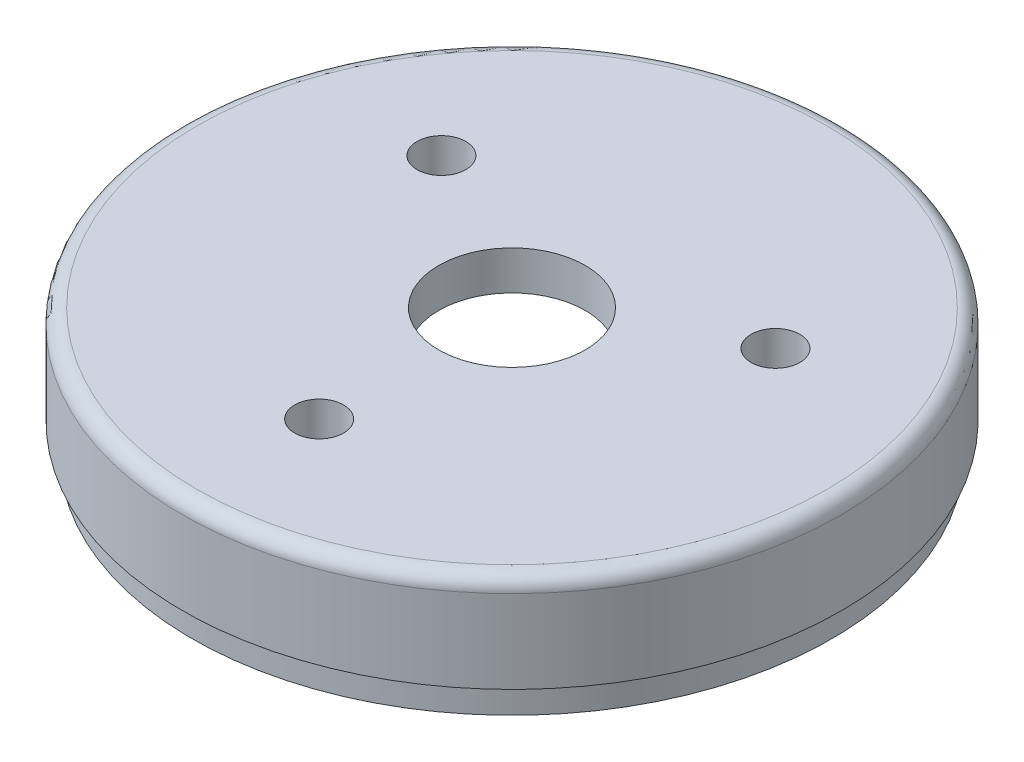
ISO-10303-21;
HEADER;
FILE_DESCRIPTION(('STEP AP214'),'2;1');
FILE_NAME('part.step','',(''),(''),'','','');
FILE_SCHEMA(('AUTOMOTIVE_DESIGN { 1 0 10303 214 1 1 1 1 }'));
ENDSEC;
DATA;
#1=APPLICATION_CONTEXT('core data for automotive mechanical design processes');
#2=APPLICATION_PROTOCOL_DEFINITION('international standard','automotive_design',2000,#1);
#3=PRODUCT_CONTEXT('',#1,'mechanical');
#4=PRODUCT('Part','Part','',(#3));
#5=PRODUCT_RELATED_PRODUCT_CATEGORY('part','',(#4));
#6=PRODUCT_DEFINITION_FORMATION('','',#4);
#7=PRODUCT_DEFINITION_CONTEXT('part definition',#1,'design');
#8=PRODUCT_DEFINITION('design','',#6,#7);
#9=PRODUCT_DEFINITION_SHAPE('','',#8);
#10=(LENGTH_UNIT() NAMED_UNIT(*) SI_UNIT(.MILLI.,.METRE.));
#11=(NAMED_UNIT(*) PLANE_ANGLE_UNIT() SI_UNIT($,.RADIAN.));
#12=(NAMED_UNIT(*) SI_UNIT($,.STERADIAN.) SOLID_ANGLE_UNIT());
#13=UNCERTAINTY_MEASURE_WITH_UNIT(LENGTH_MEASURE(1.E-05),#10,'distance_accuracy_value','');
#14=(GEOMETRIC_REPRESENTATION_CONTEXT(3) GLOBAL_UNCERTAINTY_ASSIGNED_CONTEXT((#13)) GLOBAL_UNIT_ASSIGNED_CONTEXT((#10,
#11,#12)) REPRESENTATION_CONTEXT('',''));
#15=CARTESIAN_POINT('',(0.,0.,0.));
#16=DIRECTION('',(0.,0.,1.));
#17=DIRECTION('',(1.,0.,0.));
#18=AXIS2_PLACEMENT_3D('',#15,#16,#17);
#19=CARTESIAN_POINT('',(0.,10.,0.));
#20=DIRECTION('',(0.,1.,0.));
#21=DIRECTION('',(-1.,0.,0.));
#22=AXIS2_PLACEMENT_3D('',#19,#20,#21);
#23=CYLINDRICAL_SURFACE('',#22,31.75);
#24=CARTESIAN_POINT('',(0.,-3.00000000000001,0.));
#25=DIRECTION('',(0.,1.,0.));
#26=DIRECTION('',(-1.,0.,0.));
#27=AXIS2_PLACEMENT_3D('',#24,#25,#26);
#28=CIRCLE('',#27,31.75);
#29=CARTESIAN_POINT('',(-31.75,-3.00000000000001,0.));
#30=VERTEX_POINT('',#29);
#31=EDGE_CURVE('E47',#30,#30,#28,.T.);
#32=ORIENTED_EDGE('',*,*,#31,.F.);
#33=EDGE_LOOP('',(#32));
#34=FACE_BOUND('',#33,.T.);
#35=CARTESIAN_POINT('',(0.,5.99999999999999,0.));
#36=DIRECTION('',(0.,1.,0.));
#37=DIRECTION('',(-1.,0.,0.));
#38=AXIS2_PLACEMENT_3D('',#35,#36,#37);
#39=CIRCLE('',#38,31.75);
#40=CARTESIAN_POINT('',(-31.75,5.99999999999999,0.));
#41=VERTEX_POINT('',#40);
#42=EDGE_CURVE('E57',#41,#41,#39,.T.);
#43=ORIENTED_EDGE('',*,*,#42,.T.);
#44=EDGE_LOOP('',(#43));
#45=FACE_BOUND('',#44,.T.);
#46=ADVANCED_FACE('F36',(#34,#45),#23,.F.);
#47=CARTESIAN_POINT('',(31.75,-3.,0.));
#48=DIRECTION('',(0.,1.,0.));
#49=DIRECTION('',(-1.,0.,0.));
#50=AXIS2_PLACEMENT_3D('',#47,#48,#49);
#51=PLANE('',#50);
#52=CARTESIAN_POINT('',(0.,-3.00000000000001,0.));
#53=DIRECTION('',(0.,1.,0.));
#54=DIRECTION('',(-1.,0.,0.));
#55=AXIS2_PLACEMENT_3D('',#52,#53,#54);
#56=CIRCLE('',#55,32.75);
#57=CARTESIAN_POINT('',(-32.75,-3.00000000000001,0.));
#58=VERTEX_POINT('',#57);
#59=EDGE_CURVE('E51',#58,#58,#56,.T.);
#60=ORIENTED_EDGE('',*,*,#59,.F.);
#61=EDGE_LOOP('',(#60));
#62=FACE_BOUND('',#61,.T.);
#63=ORIENTED_EDGE('',*,*,#31,.T.);
#64=EDGE_LOOP('',(#63));
#65=FACE_BOUND('',#64,.T.);
#66=ADVANCED_FACE('F119',(#62,#65),#51,.F.);
#67=CARTESIAN_POINT('',(0.,10.,0.));
#68=DIRECTION('',(0.,1.,0.));
#69=DIRECTION('',(-1.,0.,0.));
#70=AXIS2_PLACEMENT_3D('',#67,#68,#69);
#71=CYLINDRICAL_SURFACE('',#70,32.75);
#72=CARTESIAN_POINT('',(0.,0.,0.));
#73=DIRECTION('',(0.,1.,0.));
#74=DIRECTION('',(-1.,0.,0.));
#75=AXIS2_PLACEMENT_3D('',#72,#73,#74);
#76=CIRCLE('',#75,32.75);
#77=CARTESIAN_POINT('',(-32.75,0.,0.));
#78=VERTEX_POINT('',#77);
#79=EDGE_CURVE('E70',#78,#78,#76,.T.);
#80=ORIENTED_EDGE('',*,*,#79,.F.);
#81=EDGE_LOOP('',(#80));
#82=FACE_BOUND('',#81,.T.);
#83=ORIENTED_EDGE('',*,*,#59,.T.);
#84=EDGE_LOOP('',(#83));
#85=FACE_BOUND('',#84,.T.);
#86=ADVANCED_FACE('F124',(#82,#85),#71,.T.);
#87=CARTESIAN_POINT('',(32.75,0.,0.));
#88=DIRECTION('',(0.,1.,0.));
#89=DIRECTION('',(-1.,0.,0.));
#90=AXIS2_PLACEMENT_3D('',#87,#88,#89);
#91=PLANE('',#90);
#92=CARTESIAN_POINT('',(0.,0.,0.));
#93=DIRECTION('',(0.,1.,0.));
#94=DIRECTION('',(-1.,0.,0.));
#95=AXIS2_PLACEMENT_3D('',#92,#93,#94);
#96=CIRCLE('',#95,33.75);
#97=CARTESIAN_POINT('',(-33.75,0.,0.));
#98=VERTEX_POINT('',#97);
#99=EDGE_CURVE('E73',#98,#98,#96,.T.);
#100=ORIENTED_EDGE('',*,*,#99,.F.);
#101=EDGE_LOOP('',(#100));
#102=FACE_BOUND('',#101,.T.);
#103=ORIENTED_EDGE('',*,*,#79,.T.);
#104=EDGE_LOOP('',(#103));
#105=FACE_BOUND('',#104,.T.);
#106=ADVANCED_FACE('F131',(#102,#105),#91,.F.);
#107=CARTESIAN_POINT('',(0.,10.,0.));
#108=DIRECTION('',(0.,1.,0.));
#109=DIRECTION('',(-1.,0.,0.));
#110=AXIS2_PLACEMENT_3D('',#107,#108,#109);
#111=CYLINDRICAL_SURFACE('',#110,33.75);
#112=CARTESIAN_POINT('',(0.,8.5,0.));
#113=DIRECTION('',(0.,-1.,0.));
#114=DIRECTION('',(1.,0.,0.));
#115=AXIS2_PLACEMENT_3D('',#112,#113,#114);
#116=CIRCLE('',#115,33.75);
#117=CARTESIAN_POINT('',(33.75,8.5,0.));
#118=VERTEX_POINT('',#117);
#119=EDGE_CURVE('E10',#118,#118,#116,.T.);
#120=ORIENTED_EDGE('',*,*,#119,.T.);
#121=EDGE_LOOP('',(#120));
#122=FACE_BOUND('',#121,.T.);
#123=ORIENTED_EDGE('',*,*,#99,.T.);
#124=EDGE_LOOP('',(#123));
#125=FACE_BOUND('',#124,.T.);
#126=ADVANCED_FACE('F97',(#122,#125),#111,.T.);
#127=CARTESIAN_POINT('',(33.75,10.,0.));
#128=DIRECTION('',(0.,-1.,0.));
#129=DIRECTION('',(1.,0.,0.));
#130=AXIS2_PLACEMENT_3D('',#127,#128,#129);
#131=PLANE('',#130);
#132=CARTESIAN_POINT('',(0.,10.,0.));
#133=DIRECTION('',(0.,-1.,0.));
#134=DIRECTION('',(1.,0.,0.));
#135=AXIS2_PLACEMENT_3D('',#132,#133,#134);
#136=CIRCLE('',#135,32.25);
#137=CARTESIAN_POINT('',(32.25,10.,0.));
#138=VERTEX_POINT('',#137);
#139=EDGE_CURVE('E43',#138,#138,#136,.F.);
#140=ORIENTED_EDGE('',*,*,#139,.T.);
#141=EDGE_LOOP('',(#140));
#142=FACE_BOUND('',#141,.T.);
#143=CARTESIAN_POINT('',(0.,10.,19.75));
#144=DIRECTION('',(0.,1.,0.));
#145=DIRECTION('',(-1.,0.,0.));
#146=AXIS2_PLACEMENT_3D('',#143,#144,#145);
#147=CIRCLE('',#146,2.5);
#148=CARTESIAN_POINT('',(-2.5,10.,19.75));
#149=VERTEX_POINT('',#148);
#150=EDGE_CURVE('E66',#149,#149,#147,.T.);
#151=ORIENTED_EDGE('',*,*,#150,.F.);
#152=EDGE_LOOP('',(#151));
#153=FACE_BOUND('',#152,.T.);
#154=CARTESIAN_POINT('',(0.,10.,0.));
#155=DIRECTION('',(0.,1.,0.));
#156=DIRECTION('',(-1.,0.,0.));
#157=AXIS2_PLACEMENT_3D('',#154,#155,#156);
#158=CIRCLE('',#157,7.5);
#159=CARTESIAN_POINT('',(-7.5,9.99999999999999,0.));
#160=VERTEX_POINT('',#159);
#161=EDGE_CURVE('E82',#160,#160,#158,.T.);
#162=ORIENTED_EDGE('',*,*,#161,.F.);
#163=EDGE_LOOP('',(#162));
#164=FACE_BOUND('',#163,.T.);
#165=CARTESIAN_POINT('',(17.1040017247427,10.,-9.87500000000001));
#166=DIRECTION('',(0.,1.,0.));
#167=DIRECTION('',(-1.,0.,0.));
#168=AXIS2_PLACEMENT_3D('',#165,#166,#167);
#169=CIRCLE('',#168,2.5);
#170=CARTESIAN_POINT('',(14.6040017247427,10.,-9.87500000000001));
#171=VERTEX_POINT('',#170);
#172=EDGE_CURVE('E78',#171,#171,#169,.T.);
#173=ORIENTED_EDGE('',*,*,#172,.F.);
#174=EDGE_LOOP('',(#173));
#175=FACE_BOUND('',#174,.T.);
#176=CARTESIAN_POINT('',(-17.1040017247427,9.99999999999999,-9.875));
#177=DIRECTION('',(0.,1.,0.));
#178=DIRECTION('',(-1.,0.,0.));
#179=AXIS2_PLACEMENT_3D('',#176,#177,#178);
#180=CIRCLE('',#179,2.5);
#181=CARTESIAN_POINT('',(-19.6040017247427,9.99999999999999,-9.875));
#182=VERTEX_POINT('',#181);
#183=EDGE_CURVE('E81',#182,#182,#180,.T.);
#184=ORIENTED_EDGE('',*,*,#183,.F.);
#185=EDGE_LOOP('',(#184));
#186=FACE_BOUND('',#185,.T.);
#187=ADVANCED_FACE('F93',(#142,#153,#164,#175,#186),#131,.F.);
#188=CARTESIAN_POINT('',(0.,5.99999999999999,0.));
#189=DIRECTION('',(0.,1.,0.));
#190=DIRECTION('',(-1.,0.,0.));
#191=AXIS2_PLACEMENT_3D('',#188,#189,#190);
#192=PLANE('',#191);
#193=CARTESIAN_POINT('',(0.,5.99999999999999,19.75));
#194=DIRECTION('',(0.,1.,0.));
#195=DIRECTION('',(-1.,0.,0.));
#196=AXIS2_PLACEMENT_3D('',#193,#194,#195);
#197=CIRCLE('',#196,2.5);
#198=CARTESIAN_POINT('',(-2.5,5.99999999999999,19.75));
#199=VERTEX_POINT('',#198);
#200=EDGE_CURVE('E54',#199,#199,#197,.T.);
#201=ORIENTED_EDGE('',*,*,#200,.T.);
#202=EDGE_LOOP('',(#201));
#203=FACE_BOUND('',#202,.T.);
#204=CARTESIAN_POINT('',(0.,5.99999999999999,0.));
#205=DIRECTION('',(0.,1.,0.));
#206=DIRECTION('',(-1.,0.,0.));
#207=AXIS2_PLACEMENT_3D('',#204,#205,#206);
#208=CIRCLE('',#207,7.5);
#209=CARTESIAN_POINT('',(-7.5,5.99999999999999,0.));
#210=VERTEX_POINT('',#209);
#211=EDGE_CURVE('E58',#210,#210,#208,.T.);
#212=ORIENTED_EDGE('',*,*,#211,.T.);
#213=EDGE_LOOP('',(#212));
#214=FACE_BOUND('',#213,.T.);
#215=CARTESIAN_POINT('',(17.1040017247427,6.,-9.87500000000001));
#216=DIRECTION('',(0.,1.,0.));
#217=DIRECTION('',(-1.,0.,0.));
#218=AXIS2_PLACEMENT_3D('',#215,#216,#217);
#219=CIRCLE('',#218,2.5);
#220=CARTESIAN_POINT('',(14.6040017247427,6.,-9.87500000000001));
#221=VERTEX_POINT('',#220);
#222=EDGE_CURVE('E61',#221,#221,#219,.T.);
#223=ORIENTED_EDGE('',*,*,#222,.T.);
#224=EDGE_LOOP('',(#223));
#225=FACE_BOUND('',#224,.T.);
#226=CARTESIAN_POINT('',(-17.1040017247427,5.99999999999999,-9.875));
#227=DIRECTION('',(0.,1.,0.));
#228=DIRECTION('',(-1.,0.,0.));
#229=AXIS2_PLACEMENT_3D('',#226,#227,#228);
#230=CIRCLE('',#229,2.5);
#231=CARTESIAN_POINT('',(-19.6040017247427,5.99999999999999,-9.875));
#232=VERTEX_POINT('',#231);
#233=EDGE_CURVE('E64',#232,#232,#230,.T.);
#234=ORIENTED_EDGE('',*,*,#233,.T.);
#235=EDGE_LOOP('',(#234));
#236=FACE_BOUND('',#235,.T.);
#237=ORIENTED_EDGE('',*,*,#42,.F.);
#238=EDGE_LOOP('',(#237));
#239=FACE_BOUND('',#238,.T.);
#240=ADVANCED_FACE('F96',(#203,#214,#225,#236,#239),#192,.F.);
#241=CARTESIAN_POINT('',(-17.1040017247427,-3.00000000000002,-9.875));
#242=DIRECTION('',(0.,1.,0.));
#243=DIRECTION('',(-1.,0.,0.));
#244=AXIS2_PLACEMENT_3D('',#241,#242,#243);
#245=CYLINDRICAL_SURFACE('',#244,2.5);
#246=ORIENTED_EDGE('',*,*,#183,.T.);
#247=EDGE_LOOP('',(#246));
#248=FACE_BOUND('',#247,.T.);
#249=ORIENTED_EDGE('',*,*,#233,.F.);
#250=EDGE_LOOP('',(#249));
#251=FACE_BOUND('',#250,.T.);
#252=ADVANCED_FACE('F105',(#248,#251),#245,.F.);
#253=CARTESIAN_POINT('',(17.1040017247427,-3.00000000000001,-9.87500000000001));
#254=DIRECTION('',(0.,1.,0.));
#255=DIRECTION('',(-1.,0.,0.));
#256=AXIS2_PLACEMENT_3D('',#253,#254,#255);
#257=CYLINDRICAL_SURFACE('',#256,2.5);
#258=ORIENTED_EDGE('',*,*,#172,.T.);
#259=EDGE_LOOP('',(#258));
#260=FACE_BOUND('',#259,.T.);
#261=ORIENTED_EDGE('',*,*,#222,.F.);
#262=EDGE_LOOP('',(#261));
#263=FACE_BOUND('',#262,.T.);
#264=ADVANCED_FACE('F108',(#260,#263),#257,.F.);
#265=CARTESIAN_POINT('',(0.,-3.00000000000002,0.));
#266=DIRECTION('',(0.,1.,0.));
#267=DIRECTION('',(-1.,0.,0.));
#268=AXIS2_PLACEMENT_3D('',#265,#266,#267);
#269=CYLINDRICAL_SURFACE('',#268,7.5);
#270=ORIENTED_EDGE('',*,*,#161,.T.);
#271=EDGE_LOOP('',(#270));
#272=FACE_BOUND('',#271,.T.);
#273=ORIENTED_EDGE('',*,*,#211,.F.);
#274=EDGE_LOOP('',(#273));
#275=FACE_BOUND('',#274,.T.);
#276=ADVANCED_FACE('F139',(#272,#275),#269,.F.);
#277=CARTESIAN_POINT('',(0.,-3.00000000000002,19.75));
#278=DIRECTION('',(0.,1.,0.));
#279=DIRECTION('',(-1.,0.,0.));
#280=AXIS2_PLACEMENT_3D('',#277,#278,#279);
#281=CYLINDRICAL_SURFACE('',#280,2.5);
#282=ORIENTED_EDGE('',*,*,#150,.T.);
#283=EDGE_LOOP('',(#282));
#284=FACE_BOUND('',#283,.T.);
#285=ORIENTED_EDGE('',*,*,#200,.F.);
#286=EDGE_LOOP('',(#285));
#287=FACE_BOUND('',#286,.T.);
#288=ADVANCED_FACE('F90',(#284,#287),#281,.F.);
#289=CARTESIAN_POINT('',(0.,8.5,0.));
#290=DIRECTION('',(0.,-1.,0.));
#291=DIRECTION('',(1.,0.,0.));
#292=AXIS2_PLACEMENT_3D('',#289,#290,#291);
#293=TOROIDAL_SURFACE('',#292,32.25,1.5);
#294=ORIENTED_EDGE('',*,*,#119,.F.);
#295=EDGE_LOOP('',(#294));
#296=FACE_BOUND('',#295,.T.);
#297=ORIENTED_EDGE('',*,*,#139,.F.);
#298=EDGE_LOOP('',(#297));
#299=FACE_BOUND('',#298,.T.);
#300=ADVANCED_FACE('F38',(#296,#299),#293,.T.);
#301=CLOSED_SHELL('',(#46,#66,#86,#106,#126,#187,#240,#252,#264,#276,#288,#300));
#302=MANIFOLD_SOLID_BREP('B2',#301);
#303=ADVANCED_BREP_SHAPE_REPRESENTATION('',(#18,#302),#14);
#304=SHAPE_DEFINITION_REPRESENTATION(#9,#303);
ENDSEC;
END-ISO-10303-21;
